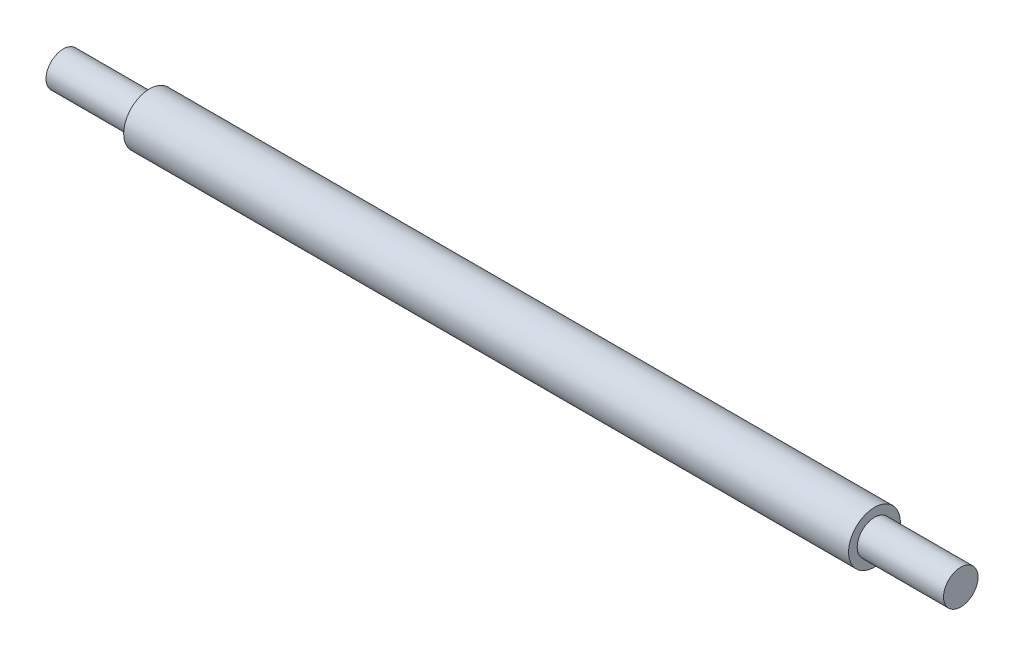
ISO-10303-21;
HEADER;
FILE_DESCRIPTION(('STEP AP214'),'2;1');
FILE_NAME('part.step','',(''),(''),'','','');
FILE_SCHEMA(('AUTOMOTIVE_DESIGN { 1 0 10303 214 1 1 1 1 }'));
ENDSEC;
DATA;
#1=APPLICATION_CONTEXT('core data for automotive mechanical design processes');
#2=APPLICATION_PROTOCOL_DEFINITION('international standard','automotive_design',2000,#1);
#3=PRODUCT_CONTEXT('',#1,'mechanical');
#4=PRODUCT('Part','Part','',(#3));
#5=PRODUCT_RELATED_PRODUCT_CATEGORY('part','',(#4));
#6=PRODUCT_DEFINITION_FORMATION('','',#4);
#7=PRODUCT_DEFINITION_CONTEXT('part definition',#1,'design');
#8=PRODUCT_DEFINITION('design','',#6,#7);
#9=PRODUCT_DEFINITION_SHAPE('','',#8);
#10=(LENGTH_UNIT() NAMED_UNIT(*) SI_UNIT(.MILLI.,.METRE.));
#11=(NAMED_UNIT(*) PLANE_ANGLE_UNIT() SI_UNIT($,.RADIAN.));
#12=(NAMED_UNIT(*) SI_UNIT($,.STERADIAN.) SOLID_ANGLE_UNIT());
#13=UNCERTAINTY_MEASURE_WITH_UNIT(LENGTH_MEASURE(1.E-05),#10,'distance_accuracy_value','');
#14=(GEOMETRIC_REPRESENTATION_CONTEXT(3) GLOBAL_UNCERTAINTY_ASSIGNED_CONTEXT((#13)) GLOBAL_UNIT_ASSIGNED_CONTEXT((#10,
#11,#12)) REPRESENTATION_CONTEXT('',''));
#15=CARTESIAN_POINT('',(0.,0.,0.));
#16=DIRECTION('',(0.,0.,1.));
#17=DIRECTION('',(1.,0.,0.));
#18=AXIS2_PLACEMENT_3D('',#15,#16,#17);
#19=CARTESIAN_POINT('',(0.,0.,0.));
#20=DIRECTION('',(1.,0.,0.));
#21=DIRECTION('',(0.,0.,-1.));
#22=AXIS2_PLACEMENT_3D('',#19,#20,#21);
#23=PLANE('',#22);
#24=CARTESIAN_POINT('',(0.,0.,0.));
#25=DIRECTION('',(-1.,0.,0.));
#26=DIRECTION('',(0.,0.,1.));
#27=AXIS2_PLACEMENT_3D('',#24,#25,#26);
#28=CIRCLE('',#27,2.);
#29=CARTESIAN_POINT('',(0.,0.,2.));
#30=VERTEX_POINT('',#29);
#31=EDGE_CURVE('E10',#30,#30,#28,.T.);
#32=ORIENTED_EDGE('',*,*,#31,.T.);
#33=EDGE_LOOP('',(#32));
#34=FACE_BOUND('',#33,.T.);
#35=ADVANCED_FACE('F37',(#34),#23,.F.);
#36=CARTESIAN_POINT('',(0.,0.,0.));
#37=DIRECTION('',(-1.,0.,0.));
#38=DIRECTION('',(0.,0.,1.));
#39=AXIS2_PLACEMENT_3D('',#36,#37,#38);
#40=CYLINDRICAL_SURFACE('',#39,2.);
#41=ORIENTED_EDGE('',*,*,#31,.F.);
#42=EDGE_LOOP('',(#41));
#43=FACE_BOUND('',#42,.T.);
#44=CARTESIAN_POINT('',(10.,0.,0.));
#45=DIRECTION('',(-1.,0.,0.));
#46=DIRECTION('',(0.,0.,1.));
#47=AXIS2_PLACEMENT_3D('',#44,#45,#46);
#48=CIRCLE('',#47,2.);
#49=CARTESIAN_POINT('',(10.,0.,2.));
#50=VERTEX_POINT('',#49);
#51=EDGE_CURVE('E44',#50,#50,#48,.T.);
#52=ORIENTED_EDGE('',*,*,#51,.T.);
#53=EDGE_LOOP('',(#52));
#54=FACE_BOUND('',#53,.T.);
#55=ADVANCED_FACE('F81',(#43,#54),#40,.T.);
#56=CARTESIAN_POINT('',(10.,2.,0.));
#57=DIRECTION('',(1.,0.,0.));
#58=DIRECTION('',(0.,0.,-1.));
#59=AXIS2_PLACEMENT_3D('',#56,#57,#58);
#60=PLANE('',#59);
#61=ORIENTED_EDGE('',*,*,#51,.F.);
#62=EDGE_LOOP('',(#61));
#63=FACE_BOUND('',#62,.T.);
#64=CARTESIAN_POINT('',(10.,0.,0.));
#65=DIRECTION('',(-1.,0.,0.));
#66=DIRECTION('',(0.,0.,1.));
#67=AXIS2_PLACEMENT_3D('',#64,#65,#66);
#68=CIRCLE('',#67,3.);
#69=CARTESIAN_POINT('',(10.,0.,3.));
#70=VERTEX_POINT('',#69);
#71=EDGE_CURVE('E49',#70,#70,#68,.T.);
#72=ORIENTED_EDGE('',*,*,#71,.T.);
#73=EDGE_LOOP('',(#72));
#74=FACE_BOUND('',#73,.T.);
#75=ADVANCED_FACE('F85',(#63,#74),#60,.F.);
#76=CARTESIAN_POINT('',(0.,0.,0.));
#77=DIRECTION('',(-1.,0.,0.));
#78=DIRECTION('',(0.,0.,1.));
#79=AXIS2_PLACEMENT_3D('',#76,#77,#78);
#80=CYLINDRICAL_SURFACE('',#79,3.);
#81=ORIENTED_EDGE('',*,*,#71,.F.);
#82=EDGE_LOOP('',(#81));
#83=FACE_BOUND('',#82,.T.);
#84=CARTESIAN_POINT('',(94.,0.,0.));
#85=DIRECTION('',(-1.,0.,0.));
#86=DIRECTION('',(0.,0.,1.));
#87=AXIS2_PLACEMENT_3D('',#84,#85,#86);
#88=CIRCLE('',#87,3.);
#89=CARTESIAN_POINT('',(94.,0.,3.));
#90=VERTEX_POINT('',#89);
#91=EDGE_CURVE('E54',#90,#90,#88,.T.);
#92=ORIENTED_EDGE('',*,*,#91,.T.);
#93=EDGE_LOOP('',(#92));
#94=FACE_BOUND('',#93,.T.);
#95=ADVANCED_FACE('F90',(#83,#94),#80,.T.);
#96=CARTESIAN_POINT('',(94.,3.,0.));
#97=DIRECTION('',(-1.,0.,0.));
#98=DIRECTION('',(0.,0.,1.));
#99=AXIS2_PLACEMENT_3D('',#96,#97,#98);
#100=PLANE('',#99);
#101=ORIENTED_EDGE('',*,*,#91,.F.);
#102=EDGE_LOOP('',(#101));
#103=FACE_BOUND('',#102,.T.);
#104=CARTESIAN_POINT('',(94.,0.,0.));
#105=DIRECTION('',(-1.,0.,0.));
#106=DIRECTION('',(0.,0.,1.));
#107=AXIS2_PLACEMENT_3D('',#104,#105,#106);
#108=CIRCLE('',#107,2.);
#109=CARTESIAN_POINT('',(94.,0.,2.));
#110=VERTEX_POINT('',#109);
#111=EDGE_CURVE('E60',#110,#110,#108,.T.);
#112=ORIENTED_EDGE('',*,*,#111,.T.);
#113=EDGE_LOOP('',(#112));
#114=FACE_BOUND('',#113,.T.);
#115=ADVANCED_FACE('F77',(#103,#114),#100,.F.);
#116=CARTESIAN_POINT('',(0.,0.,0.));
#117=DIRECTION('',(-1.,0.,0.));
#118=DIRECTION('',(0.,0.,1.));
#119=AXIS2_PLACEMENT_3D('',#116,#117,#118);
#120=CYLINDRICAL_SURFACE('',#119,2.);
#121=ORIENTED_EDGE('',*,*,#111,.F.);
#122=EDGE_LOOP('',(#121));
#123=FACE_BOUND('',#122,.T.);
#124=CARTESIAN_POINT('',(104.,0.,0.));
#125=DIRECTION('',(-1.,0.,0.));
#126=DIRECTION('',(0.,0.,1.));
#127=AXIS2_PLACEMENT_3D('',#124,#125,#126);
#128=CIRCLE('',#127,2.);
#129=CARTESIAN_POINT('',(104.,0.,2.));
#130=VERTEX_POINT('',#129);
#131=EDGE_CURVE('E64',#130,#130,#128,.T.);
#132=ORIENTED_EDGE('',*,*,#131,.T.);
#133=EDGE_LOOP('',(#132));
#134=FACE_BOUND('',#133,.T.);
#135=ADVANCED_FACE('F69',(#123,#134),#120,.T.);
#136=CARTESIAN_POINT('',(104.,0.,0.));
#137=DIRECTION('',(-1.,0.,0.));
#138=DIRECTION('',(0.,0.,1.));
#139=AXIS2_PLACEMENT_3D('',#136,#137,#138);
#140=PLANE('',#139);
#141=ORIENTED_EDGE('',*,*,#131,.F.);
#142=EDGE_LOOP('',(#141));
#143=FACE_BOUND('',#142,.T.);
#144=ADVANCED_FACE('F71',(#143),#140,.F.);
#145=CLOSED_SHELL('',(#35,#55,#75,#95,#115,#135,#144));
#146=MANIFOLD_SOLID_BREP('B2',#145);
#147=ADVANCED_BREP_SHAPE_REPRESENTATION('',(#18,#146),#14);
#148=SHAPE_DEFINITION_REPRESENTATION(#9,#147);
ENDSEC;
END-ISO-10303-21;
